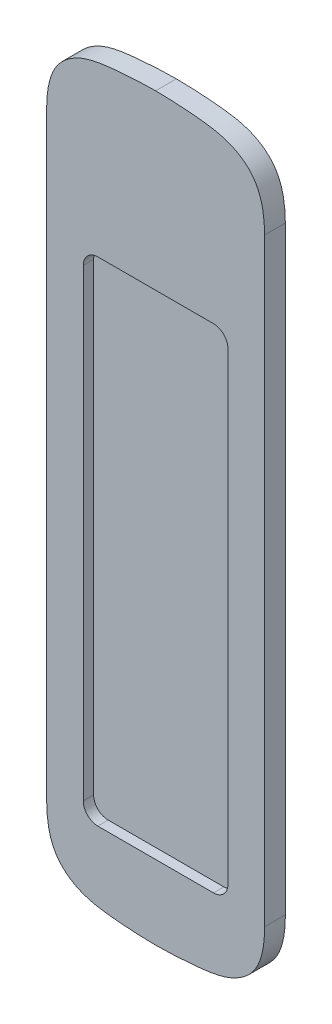
ISO-10303-21;
HEADER;
FILE_DESCRIPTION(('STEP AP214'),'2;1');
FILE_NAME('part.step','',(''),(''),'','','');
FILE_SCHEMA(('AUTOMOTIVE_DESIGN { 1 0 10303 214 1 1 1 1 }'));
ENDSEC;
DATA;
#1=APPLICATION_CONTEXT('core data for automotive mechanical design processes');
#2=APPLICATION_PROTOCOL_DEFINITION('international standard','automotive_design',2000,#1);
#3=PRODUCT_CONTEXT('',#1,'mechanical');
#4=PRODUCT('Part','Part','',(#3));
#5=PRODUCT_RELATED_PRODUCT_CATEGORY('part','',(#4));
#6=PRODUCT_DEFINITION_FORMATION('','',#4);
#7=PRODUCT_DEFINITION_CONTEXT('part definition',#1,'design');
#8=PRODUCT_DEFINITION('design','',#6,#7);
#9=PRODUCT_DEFINITION_SHAPE('','',#8);
#10=(LENGTH_UNIT() NAMED_UNIT(*) SI_UNIT(.MILLI.,.METRE.));
#11=(NAMED_UNIT(*) PLANE_ANGLE_UNIT() SI_UNIT($,.RADIAN.));
#12=(NAMED_UNIT(*) SI_UNIT($,.STERADIAN.) SOLID_ANGLE_UNIT());
#13=UNCERTAINTY_MEASURE_WITH_UNIT(LENGTH_MEASURE(1.E-05),#10,'distance_accuracy_value','');
#14=(GEOMETRIC_REPRESENTATION_CONTEXT(3) GLOBAL_UNCERTAINTY_ASSIGNED_CONTEXT((#13)) GLOBAL_UNIT_ASSIGNED_CONTEXT((#10,
#11,#12)) REPRESENTATION_CONTEXT('',''));
#15=CARTESIAN_POINT('',(0.,0.,0.));
#16=DIRECTION('',(0.,0.,1.));
#17=DIRECTION('',(1.,0.,0.));
#18=AXIS2_PLACEMENT_3D('',#15,#16,#17);
#19=CARTESIAN_POINT('',(-0.0122740685174845,-55.692882672514,1.));
#20=CARTESIAN_POINT('',(0.433053801516718,-55.6929315109198,1.));
#21=CARTESIAN_POINT('',(1.21932204899037,-55.6502766932318,1.));
#22=CARTESIAN_POINT('',(2.3591068483519,-55.5673054083304,1.));
#23=CARTESIAN_POINT('',(3.37474011353783,-55.3731999454156,1.));
#24=CARTESIAN_POINT('',(4.15776912429931,-55.003717167909,1.));
#25=CARTESIAN_POINT('',(5.11245324302639,-54.080149921374,1.));
#26=CARTESIAN_POINT('',(5.24423894281983,-52.9903180868331,1.));
#27=CARTESIAN_POINT('',(5.24423894306295,-52.2963469939325,1.));
#28=B_SPLINE_CURVE_WITH_KNOTS('',3,(#19,#20,#21,#22,#23,#24,#25,#26,#27),.UNSPECIFIED.,.F.,.F.,
(4,1,1,1,1,1,4),(0.,0.168658618872294,0.34779335919909,0.462795529222339,0.595545999496961,
0.698839991713686,1.),.UNSPECIFIED.);
#29=DIRECTION('',(0.,0.,-1.));
#30=VECTOR('',#29,1.);
#31=SURFACE_OF_LINEAR_EXTRUSION('',#28,#30);
#32=CARTESIAN_POINT('',(-0.0122740685174845,-55.692882672514,0.));
#33=CARTESIAN_POINT('',(0.433053801516718,-55.6929315109198,0.));
#34=CARTESIAN_POINT('',(1.21932204899037,-55.6502766932318,0.));
#35=CARTESIAN_POINT('',(2.3591068483519,-55.5673054083304,0.));
#36=CARTESIAN_POINT('',(3.37474011353783,-55.3731999454156,0.));
#37=CARTESIAN_POINT('',(4.15776912429931,-55.003717167909,0.));
#38=CARTESIAN_POINT('',(5.11245324302639,-54.080149921374,0.));
#39=CARTESIAN_POINT('',(5.24423894281983,-52.9903180868331,0.));
#40=CARTESIAN_POINT('',(5.24423894306295,-52.2963469939325,0.));
#41=B_SPLINE_CURVE_WITH_KNOTS('',3,(#32,#33,#34,#35,#36,#37,#38,#39,#40),.UNSPECIFIED.,.F.,.F.,
(4,1,1,1,1,1,4),(0.,0.168658618872294,0.34779335919909,0.462795529222339,0.595545999496961,
0.698839991713686,1.),.UNSPECIFIED.);
#42=CARTESIAN_POINT('',(-0.0122740685174938,-55.692882672514,0.));
#43=VERTEX_POINT('',#42);
#44=CARTESIAN_POINT('',(5.24423894306295,-52.2963469939325,0.));
#45=VERTEX_POINT('',#44);
#46=EDGE_CURVE('E155',#43,#45,#41,.T.);
#47=ORIENTED_EDGE('',*,*,#46,.T.);
#48=DIRECTION('',(0.,0.,-1.));
#49=VECTOR('',#48,1.);
#50=CARTESIAN_POINT('',(5.24423894306295,-52.2963469939325,1.));
#51=LINE('',#50,#49);
#52=CARTESIAN_POINT('',(5.24423894306295,-52.2963469939325,1.));
#53=VERTEX_POINT('',#52);
#54=EDGE_CURVE('E136',#53,#45,#51,.T.);
#55=ORIENTED_EDGE('',*,*,#54,.F.);
#56=CARTESIAN_POINT('',(-0.0122740685174938,-55.692882672514,1.));
#57=VERTEX_POINT('',#56);
#58=EDGE_CURVE('E143',#57,#53,#28,.T.);
#59=ORIENTED_EDGE('',*,*,#58,.F.);
#60=DIRECTION('',(0.,0.,-1.));
#61=VECTOR('',#60,1.);
#62=CARTESIAN_POINT('',(-0.0122740685174938,-55.692882672514,1.));
#63=LINE('',#62,#61);
#64=EDGE_CURVE('E297',#57,#43,#63,.T.);
#65=ORIENTED_EDGE('',*,*,#64,.T.);
#66=EDGE_LOOP('',(#47,#55,#59,#65));
#67=FACE_BOUND('',#66,.T.);
#68=ADVANCED_FACE('F32',(#67),#31,.F.);
#69=CARTESIAN_POINT('',(5.24423894306295,-52.2963469939325,1.));
#70=DIRECTION('',(-1.,3.50327697949891E-10,0.));
#71=DIRECTION('',(-3.50327697949891E-10,-1.,0.));
#72=AXIS2_PLACEMENT_3D('',#69,#70,#71);
#73=PLANE('',#72);
#74=DIRECTION('',(3.50327697949891E-10,1.,0.));
#75=VECTOR('',#74,1.);
#76=CARTESIAN_POINT('',(5.24423894306295,-52.2963469939325,0.));
#77=LINE('',#76,#75);
#78=CARTESIAN_POINT('',(5.24423895318766,-23.3956530813809,0.));
#79=VERTEX_POINT('',#78);
#80=EDGE_CURVE('E306',#45,#79,#77,.T.);
#81=ORIENTED_EDGE('',*,*,#80,.T.);
#82=DIRECTION('',(0.,0.,-1.));
#83=VECTOR('',#82,1.);
#84=CARTESIAN_POINT('',(5.24423895318766,-23.3956530813809,1.));
#85=LINE('',#84,#83);
#86=CARTESIAN_POINT('',(5.24423895318766,-23.3956530813809,1.));
#87=VERTEX_POINT('',#86);
#88=EDGE_CURVE('E139',#87,#79,#85,.T.);
#89=ORIENTED_EDGE('',*,*,#88,.F.);
#90=DIRECTION('',(3.50327697949891E-10,1.,0.));
#91=VECTOR('',#90,1.);
#92=CARTESIAN_POINT('',(5.24423894306295,-52.2963469939325,1.));
#93=LINE('',#92,#91);
#94=EDGE_CURVE('E132',#53,#87,#93,.T.);
#95=ORIENTED_EDGE('',*,*,#94,.F.);
#96=ORIENTED_EDGE('',*,*,#54,.T.);
#97=EDGE_LOOP('',(#81,#89,#95,#96));
#98=FACE_BOUND('',#97,.T.);
#99=ADVANCED_FACE('F134',(#98),#73,.F.);
#100=CARTESIAN_POINT('',(5.24423895318766,-23.3956530813809,1.));
#101=CARTESIAN_POINT('',(5.24423895343078,-22.7016819884803,1.));
#102=CARTESIAN_POINT('',(5.11245325440093,-21.6118501538471,1.));
#103=CARTESIAN_POINT('',(4.15776913632095,-20.6882829066432,1.));
#104=CARTESIAN_POINT('',(3.37474012581835,-20.3188001285879,1.));
#105=CARTESIAN_POINT('',(2.35910686076843,-20.1246946649615,1.));
#106=CARTESIAN_POINT('',(1.21932206146504,-20.0417233792615,1.));
#107=CARTESIAN_POINT('',(0.433053814021267,-19.9990685610227,1.));
#108=CARTESIAN_POINT('',(-0.0122740560129697,-19.9991173991164,1.));
#109=B_SPLINE_CURVE_WITH_KNOTS('',3,(#100,#101,#102,#103,#104,#105,#106,#107,#108),
.UNSPECIFIED.,.F.,.F.,(4,1,1,1,1,1,4),(0.,0.301160008286314,0.404454000503039,0.537204470777661,
0.65220664080091,0.831341381127706,1.),.UNSPECIFIED.);
#110=DIRECTION('',(0.,0.,-1.));
#111=VECTOR('',#110,1.);
#112=SURFACE_OF_LINEAR_EXTRUSION('',#109,#111);
#113=CARTESIAN_POINT('',(5.24423895318766,-23.3956530813809,0.));
#114=CARTESIAN_POINT('',(5.24423895343078,-22.7016819884803,0.));
#115=CARTESIAN_POINT('',(5.11245325440093,-21.6118501538471,0.));
#116=CARTESIAN_POINT('',(4.15776913632095,-20.6882829066432,0.));
#117=CARTESIAN_POINT('',(3.37474012581835,-20.3188001285879,0.));
#118=CARTESIAN_POINT('',(2.35910686076843,-20.1246946649615,0.));
#119=CARTESIAN_POINT('',(1.21932206146504,-20.0417233792615,0.));
#120=CARTESIAN_POINT('',(0.433053814021267,-19.9990685610227,0.));
#121=CARTESIAN_POINT('',(-0.0122740560129697,-19.9991173991164,0.));
#122=B_SPLINE_CURVE_WITH_KNOTS('',3,(#113,#114,#115,#116,#117,#118,#119,#120,#121),
.UNSPECIFIED.,.F.,.F.,(4,1,1,1,1,1,4),(0.,0.301160008286314,0.404454000503039,0.537204470777661,
0.65220664080091,0.831341381127706,1.),.UNSPECIFIED.);
#123=CARTESIAN_POINT('',(-0.0122740560129697,-19.9991173991164,0.));
#124=VERTEX_POINT('',#123);
#125=EDGE_CURVE('E311',#79,#124,#122,.T.);
#126=ORIENTED_EDGE('',*,*,#125,.T.);
#127=DIRECTION('',(0.,0.,-1.));
#128=VECTOR('',#127,1.);
#129=CARTESIAN_POINT('',(-0.0122740560129697,-19.9991173991164,1.));
#130=LINE('',#129,#128);
#131=CARTESIAN_POINT('',(-0.0122740560129697,-19.9991173991164,1.));
#132=VERTEX_POINT('',#131);
#133=EDGE_CURVE('E160',#132,#124,#130,.T.);
#134=ORIENTED_EDGE('',*,*,#133,.F.);
#135=EDGE_CURVE('E142',#87,#132,#109,.T.);
#136=ORIENTED_EDGE('',*,*,#135,.F.);
#137=ORIENTED_EDGE('',*,*,#88,.T.);
#138=EDGE_LOOP('',(#126,#134,#136,#137));
#139=FACE_BOUND('',#138,.T.);
#140=ADVANCED_FACE('F354',(#139),#112,.F.);
#141=CARTESIAN_POINT('',(-0.0122740560129834,-19.9991173991164,1.));
#142=CARTESIAN_POINT('',(-0.457601926047186,-19.9990685607107,1.));
#143=CARTESIAN_POINT('',(-1.24387017352084,-20.0417233783986,1.));
#144=CARTESIAN_POINT('',(-2.38365497288237,-20.1246946633,1.));
#145=CARTESIAN_POINT('',(-3.39928823806829,-20.3188001262148,1.));
#146=CARTESIAN_POINT('',(-4.18231724882977,-20.6882829037214,1.));
#147=CARTESIAN_POINT('',(-5.13700136755686,-21.6118501502564,1.));
#148=CARTESIAN_POINT('',(-5.2687870673503,-22.7016819847973,1.));
#149=CARTESIAN_POINT('',(-5.26878706759342,-23.3956530776979,1.));
#150=B_SPLINE_CURVE_WITH_KNOTS('',3,(#141,#142,#143,#144,#145,#146,#147,#148,#149),
.UNSPECIFIED.,.F.,.F.,(4,1,1,1,1,1,4),(0.,0.168658618872294,0.34779335919909,0.462795529222339,
0.595545999496961,0.698839991713686,1.),.UNSPECIFIED.);
#151=DIRECTION('',(0.,0.,-1.));
#152=VECTOR('',#151,1.);
#153=SURFACE_OF_LINEAR_EXTRUSION('',#150,#152);
#154=CARTESIAN_POINT('',(-0.0122740560129834,-19.9991173991164,0.));
#155=CARTESIAN_POINT('',(-0.457601926047186,-19.9990685607107,0.));
#156=CARTESIAN_POINT('',(-1.24387017352084,-20.0417233783986,0.));
#157=CARTESIAN_POINT('',(-2.38365497288237,-20.1246946633,0.));
#158=CARTESIAN_POINT('',(-3.39928823806829,-20.3188001262148,0.));
#159=CARTESIAN_POINT('',(-4.18231724882977,-20.6882829037214,0.));
#160=CARTESIAN_POINT('',(-5.13700136755686,-21.6118501502564,0.));
#161=CARTESIAN_POINT('',(-5.2687870673503,-22.7016819847973,0.));
#162=CARTESIAN_POINT('',(-5.26878706759342,-23.3956530776979,0.));
#163=B_SPLINE_CURVE_WITH_KNOTS('',3,(#154,#155,#156,#157,#158,#159,#160,#161,#162),
.UNSPECIFIED.,.F.,.F.,(4,1,1,1,1,1,4),(0.,0.168658618872294,0.34779335919909,0.462795529222339,
0.595545999496961,0.698839991713686,1.),.UNSPECIFIED.);
#164=CARTESIAN_POINT('',(-5.26878706759342,-23.3956530776979,0.));
#165=VERTEX_POINT('',#164);
#166=EDGE_CURVE('E315',#124,#165,#163,.T.);
#167=ORIENTED_EDGE('',*,*,#166,.T.);
#168=DIRECTION('',(0.,0.,-1.));
#169=VECTOR('',#168,1.);
#170=CARTESIAN_POINT('',(-5.26878706759342,-23.3956530776979,1.));
#171=LINE('',#170,#169);
#172=CARTESIAN_POINT('',(-5.26878706759342,-23.3956530776979,1.));
#173=VERTEX_POINT('',#172);
#174=EDGE_CURVE('E337',#173,#165,#171,.T.);
#175=ORIENTED_EDGE('',*,*,#174,.F.);
#176=EDGE_CURVE('E346',#132,#173,#150,.T.);
#177=ORIENTED_EDGE('',*,*,#176,.F.);
#178=ORIENTED_EDGE('',*,*,#133,.T.);
#179=EDGE_LOOP('',(#167,#175,#177,#178));
#180=FACE_BOUND('',#179,.T.);
#181=ADVANCED_FACE('F344',(#180),#153,.F.);
#182=CARTESIAN_POINT('',(-5.26878706759342,-23.3956530776979,1.));
#183=DIRECTION('',(1.,-3.50327577902706E-10,0.));
#184=DIRECTION('',(3.50327577902706E-10,1.,0.));
#185=AXIS2_PLACEMENT_3D('',#182,#183,#184);
#186=PLANE('',#185);
#187=DIRECTION('',(-3.50327577902706E-10,-1.,0.));
#188=VECTOR('',#187,1.);
#189=CARTESIAN_POINT('',(-5.26878706759342,-23.3956530776979,0.));
#190=LINE('',#189,#188);
#191=CARTESIAN_POINT('',(-5.26878707771813,-52.2963469902495,0.));
#192=VERTEX_POINT('',#191);
#193=EDGE_CURVE('E322',#165,#192,#190,.T.);
#194=ORIENTED_EDGE('',*,*,#193,.T.);
#195=DIRECTION('',(0.,0.,-1.));
#196=VECTOR('',#195,1.);
#197=CARTESIAN_POINT('',(-5.26878707771813,-52.2963469902495,1.));
#198=LINE('',#197,#196);
#199=CARTESIAN_POINT('',(-5.26878707771813,-52.2963469902495,1.));
#200=VERTEX_POINT('',#199);
#201=EDGE_CURVE('E334',#200,#192,#198,.T.);
#202=ORIENTED_EDGE('',*,*,#201,.F.);
#203=DIRECTION('',(-3.50327577902706E-10,-1.,0.));
#204=VECTOR('',#203,1.);
#205=CARTESIAN_POINT('',(-5.26878706759342,-23.3956530776979,1.));
#206=LINE('',#205,#204);
#207=EDGE_CURVE('E298',#173,#200,#206,.T.);
#208=ORIENTED_EDGE('',*,*,#207,.F.);
#209=ORIENTED_EDGE('',*,*,#174,.T.);
#210=EDGE_LOOP('',(#194,#202,#208,#209));
#211=FACE_BOUND('',#210,.T.);
#212=ADVANCED_FACE('F289',(#211),#186,.F.);
#213=CARTESIAN_POINT('',(-5.26878707771813,-52.2963469902495,1.));
#214=CARTESIAN_POINT('',(-5.26878707796125,-52.9903180831501,1.));
#215=CARTESIAN_POINT('',(-5.1370013789314,-54.0801499177833,1.));
#216=CARTESIAN_POINT('',(-4.18231726085142,-55.0037171649872,1.));
#217=CARTESIAN_POINT('',(-3.39928825034882,-55.3731999430425,1.));
#218=CARTESIAN_POINT('',(-2.3836549852989,-55.5673054066689,1.));
#219=CARTESIAN_POINT('',(-1.2438701859955,-55.6502766923689,1.));
#220=CARTESIAN_POINT('',(-0.45760193855173,-55.6929315106077,1.));
#221=CARTESIAN_POINT('',(-0.0122740685174938,-55.692882672514,1.));
#222=B_SPLINE_CURVE_WITH_KNOTS('',3,(#213,#214,#215,#216,#217,#218,#219,#220,#221),
.UNSPECIFIED.,.F.,.F.,(4,1,1,1,1,1,4),(0.,0.301160008286314,0.404454000503039,0.537204470777661,
0.65220664080091,0.831341381127706,1.),.UNSPECIFIED.);
#223=DIRECTION('',(0.,0.,-1.));
#224=VECTOR('',#223,1.);
#225=SURFACE_OF_LINEAR_EXTRUSION('',#222,#224);
#226=CARTESIAN_POINT('',(-5.26878707771813,-52.2963469902495,0.));
#227=CARTESIAN_POINT('',(-5.26878707796125,-52.9903180831501,0.));
#228=CARTESIAN_POINT('',(-5.1370013789314,-54.0801499177833,0.));
#229=CARTESIAN_POINT('',(-4.18231726085142,-55.0037171649872,0.));
#230=CARTESIAN_POINT('',(-3.39928825034882,-55.3731999430425,0.));
#231=CARTESIAN_POINT('',(-2.3836549852989,-55.5673054066689,0.));
#232=CARTESIAN_POINT('',(-1.2438701859955,-55.6502766923689,0.));
#233=CARTESIAN_POINT('',(-0.45760193855173,-55.6929315106077,0.));
#234=CARTESIAN_POINT('',(-0.0122740685174938,-55.692882672514,0.));
#235=B_SPLINE_CURVE_WITH_KNOTS('',3,(#226,#227,#228,#229,#230,#231,#232,#233,#234),
.UNSPECIFIED.,.F.,.F.,(4,1,1,1,1,1,4),(0.,0.301160008286314,0.404454000503039,0.537204470777661,
0.65220664080091,0.831341381127706,1.),.UNSPECIFIED.);
#236=EDGE_CURVE('E152',#192,#43,#235,.T.);
#237=ORIENTED_EDGE('',*,*,#236,.T.);
#238=ORIENTED_EDGE('',*,*,#64,.F.);
#239=EDGE_CURVE('E148',#200,#57,#222,.T.);
#240=ORIENTED_EDGE('',*,*,#239,.F.);
#241=ORIENTED_EDGE('',*,*,#201,.T.);
#242=EDGE_LOOP('',(#237,#238,#240,#241));
#243=FACE_BOUND('',#242,.T.);
#244=ADVANCED_FACE('F282',(#243),#225,.F.);
#245=CARTESIAN_POINT('',(3.57942521402291,-55.2574550946814,1.));
#246=DIRECTION('',(0.,0.,-1.));
#247=DIRECTION('',(-1.,0.,0.));
#248=AXIS2_PLACEMENT_3D('',#245,#246,#247);
#249=PLANE('',#248);
#250=DIRECTION('',(1.,0.,0.));
#251=VECTOR('',#250,1.);
#252=CARTESIAN_POINT('',(-3.5022740446155,-28.332000037375,1.));
#253=LINE('',#252,#251);
#254=CARTESIAN_POINT('',(-2.8022740446155,-28.332000037375,1.));
#255=VERTEX_POINT('',#254);
#256=CARTESIAN_POINT('',(2.77772593178569,-28.332000037375,1.));
#257=VERTEX_POINT('',#256);
#258=EDGE_CURVE('E225',#255,#257,#253,.T.);
#259=ORIENTED_EDGE('',*,*,#258,.T.);
#260=CARTESIAN_POINT('',(2.77772593178569,-29.032000037375,1.));
#261=DIRECTION('',(0.,0.,-1.));
#262=DIRECTION('',(-1.,0.,0.));
#263=AXIS2_PLACEMENT_3D('',#260,#261,#262);
#264=CIRCLE('',#263,0.7);
#265=CARTESIAN_POINT('',(3.47772593178569,-29.032000037375,1.));
#266=VERTEX_POINT('',#265);
#267=EDGE_CURVE('E11',#257,#266,#264,.T.);
#268=ORIENTED_EDGE('',*,*,#267,.T.);
#269=DIRECTION('',(0.,-1.,0.));
#270=VECTOR('',#269,1.);
#271=CARTESIAN_POINT('',(3.47772593178569,-28.332000037375,1.));
#272=LINE('',#271,#270);
#273=CARTESIAN_POINT('',(3.4777259317857,-51.412000037375,1.));
#274=VERTEX_POINT('',#273);
#275=EDGE_CURVE('E194',#266,#274,#272,.T.);
#276=ORIENTED_EDGE('',*,*,#275,.T.);
#277=CARTESIAN_POINT('',(2.7777259317857,-51.412000037375,1.));
#278=DIRECTION('',(0.,0.,-1.));
#279=DIRECTION('',(-1.,0.,0.));
#280=AXIS2_PLACEMENT_3D('',#277,#278,#279);
#281=CIRCLE('',#280,0.7);
#282=CARTESIAN_POINT('',(2.7777259317857,-52.112000037375,1.));
#283=VERTEX_POINT('',#282);
#284=EDGE_CURVE('E40',#274,#283,#281,.T.);
#285=ORIENTED_EDGE('',*,*,#284,.T.);
#286=DIRECTION('',(1.,0.,0.));
#287=VECTOR('',#286,1.);
#288=CARTESIAN_POINT('',(-3.5022740446155,-52.112000037375,1.));
#289=LINE('',#288,#287);
#290=CARTESIAN_POINT('',(-2.8022740446155,-52.112000037375,1.));
#291=VERTEX_POINT('',#290);
#292=EDGE_CURVE('E193',#291,#283,#289,.T.);
#293=ORIENTED_EDGE('',*,*,#292,.F.);
#294=CARTESIAN_POINT('',(-2.8022740446155,-51.412000037375,1.));
#295=DIRECTION('',(0.,0.,-1.));
#296=DIRECTION('',(-1.,0.,0.));
#297=AXIS2_PLACEMENT_3D('',#294,#295,#296);
#298=CIRCLE('',#297,0.7);
#299=CARTESIAN_POINT('',(-3.5022740446155,-51.412000037375,1.));
#300=VERTEX_POINT('',#299);
#301=EDGE_CURVE('E190',#291,#300,#298,.T.);
#302=ORIENTED_EDGE('',*,*,#301,.T.);
#303=DIRECTION('',(0.,-1.,0.));
#304=VECTOR('',#303,1.);
#305=CARTESIAN_POINT('',(-3.5022740446155,-28.332000037375,1.));
#306=LINE('',#305,#304);
#307=CARTESIAN_POINT('',(-3.5022740446155,-29.032000037375,1.));
#308=VERTEX_POINT('',#307);
#309=EDGE_CURVE('E219',#308,#300,#306,.T.);
#310=ORIENTED_EDGE('',*,*,#309,.F.);
#311=CARTESIAN_POINT('',(-2.8022740446155,-29.032000037375,1.));
#312=DIRECTION('',(0.,0.,-1.));
#313=DIRECTION('',(-1.,0.,0.));
#314=AXIS2_PLACEMENT_3D('',#311,#312,#313);
#315=CIRCLE('',#314,0.7);
#316=EDGE_CURVE('E188',#308,#255,#315,.T.);
#317=ORIENTED_EDGE('',*,*,#316,.T.);
#318=EDGE_LOOP('',(#259,#268,#276,#285,#293,#302,#310,#317));
#319=FACE_BOUND('',#318,.T.);
#320=ORIENTED_EDGE('',*,*,#58,.T.);
#321=ORIENTED_EDGE('',*,*,#94,.T.);
#322=ORIENTED_EDGE('',*,*,#135,.T.);
#323=ORIENTED_EDGE('',*,*,#176,.T.);
#324=ORIENTED_EDGE('',*,*,#207,.T.);
#325=ORIENTED_EDGE('',*,*,#239,.T.);
#326=EDGE_LOOP('',(#320,#321,#322,#323,#324,#325));
#327=FACE_BOUND('',#326,.T.);
#328=ADVANCED_FACE('F146',(#319,#327),#249,.F.);
#329=CARTESIAN_POINT('',(3.57942521402291,-55.2574550946814,0.));
#330=DIRECTION('',(0.,0.,-1.));
#331=DIRECTION('',(-1.,0.,0.));
#332=AXIS2_PLACEMENT_3D('',#329,#330,#331);
#333=PLANE('',#332);
#334=ORIENTED_EDGE('',*,*,#46,.F.);
#335=ORIENTED_EDGE('',*,*,#236,.F.);
#336=ORIENTED_EDGE('',*,*,#193,.F.);
#337=ORIENTED_EDGE('',*,*,#166,.F.);
#338=ORIENTED_EDGE('',*,*,#125,.F.);
#339=ORIENTED_EDGE('',*,*,#80,.F.);
#340=EDGE_LOOP('',(#334,#335,#336,#337,#338,#339));
#341=FACE_BOUND('',#340,.T.);
#342=ADVANCED_FACE('F274',(#341),#333,.T.);
#343=CARTESIAN_POINT('',(-3.5022740446155,-52.112000037375,0.5));
#344=DIRECTION('',(0.,-1.,0.));
#345=DIRECTION('',(0.,0.,-1.));
#346=AXIS2_PLACEMENT_3D('',#343,#344,#345);
#347=PLANE('',#346);
#348=DIRECTION('',(1.,0.,0.));
#349=VECTOR('',#348,1.);
#350=CARTESIAN_POINT('',(-3.5022740446155,-52.112000037375,0.5));
#351=LINE('',#350,#349);
#352=CARTESIAN_POINT('',(-2.8022740446155,-52.112000037375,0.5));
#353=VERTEX_POINT('',#352);
#354=CARTESIAN_POINT('',(2.7777259317857,-52.112000037375,0.5));
#355=VERTEX_POINT('',#354);
#356=EDGE_CURVE('E210',#353,#355,#351,.T.);
#357=ORIENTED_EDGE('',*,*,#356,.F.);
#358=DIRECTION('',(0.,0.,1.));
#359=VECTOR('',#358,1.);
#360=CARTESIAN_POINT('',(-2.8022740446155,-52.112000037375,1.));
#361=LINE('',#360,#359);
#362=EDGE_CURVE('E181',#353,#291,#361,.T.);
#363=ORIENTED_EDGE('',*,*,#362,.T.);
#364=ORIENTED_EDGE('',*,*,#292,.T.);
#365=DIRECTION('',(0.,0.,1.));
#366=VECTOR('',#365,1.);
#367=CARTESIAN_POINT('',(2.7777259317857,-52.112000037375,0.5));
#368=LINE('',#367,#366);
#369=EDGE_CURVE('E179',#283,#355,#368,.F.);
#370=ORIENTED_EDGE('',*,*,#369,.T.);
#371=EDGE_LOOP('',(#357,#363,#364,#370));
#372=FACE_BOUND('',#371,.T.);
#373=ADVANCED_FACE('F197',(#372),#347,.F.);
#374=CARTESIAN_POINT('',(-3.5022740446155,-28.332000037375,0.5));
#375=DIRECTION('',(-1.,0.,0.));
#376=DIRECTION('',(0.,-1.,0.));
#377=AXIS2_PLACEMENT_3D('',#374,#375,#376);
#378=PLANE('',#377);
#379=DIRECTION('',(0.,-1.,0.));
#380=VECTOR('',#379,1.);
#381=CARTESIAN_POINT('',(-3.5022740446155,-28.332000037375,0.5));
#382=LINE('',#381,#380);
#383=CARTESIAN_POINT('',(-3.5022740446155,-29.032000037375,0.5));
#384=VERTEX_POINT('',#383);
#385=CARTESIAN_POINT('',(-3.5022740446155,-51.412000037375,0.5));
#386=VERTEX_POINT('',#385);
#387=EDGE_CURVE('E217',#384,#386,#382,.T.);
#388=ORIENTED_EDGE('',*,*,#387,.F.);
#389=DIRECTION('',(0.,0.,1.));
#390=VECTOR('',#389,1.);
#391=CARTESIAN_POINT('',(-3.5022740446155,-29.032000037375,0.5));
#392=LINE('',#391,#390);
#393=EDGE_CURVE('E158',#384,#308,#392,.T.);
#394=ORIENTED_EDGE('',*,*,#393,.T.);
#395=ORIENTED_EDGE('',*,*,#309,.T.);
#396=DIRECTION('',(0.,0.,1.));
#397=VECTOR('',#396,1.);
#398=CARTESIAN_POINT('',(-3.5022740446155,-51.412000037375,0.5));
#399=LINE('',#398,#397);
#400=EDGE_CURVE('E156',#300,#386,#399,.F.);
#401=ORIENTED_EDGE('',*,*,#400,.T.);
#402=EDGE_LOOP('',(#388,#394,#395,#401));
#403=FACE_BOUND('',#402,.T.);
#404=ADVANCED_FACE('F264',(#403),#378,.F.);
#405=CARTESIAN_POINT('',(-3.5022740446155,-28.332000037375,0.5));
#406=DIRECTION('',(0.,-1.,0.));
#407=DIRECTION('',(0.,0.,-1.));
#408=AXIS2_PLACEMENT_3D('',#405,#406,#407);
#409=PLANE('',#408);
#410=ORIENTED_EDGE('',*,*,#258,.F.);
#411=DIRECTION('',(0.,0.,1.));
#412=VECTOR('',#411,1.);
#413=CARTESIAN_POINT('',(-2.8022740446155,-28.332000037375,0.5));
#414=LINE('',#413,#412);
#415=CARTESIAN_POINT('',(-2.8022740446155,-28.332000037375,0.5));
#416=VERTEX_POINT('',#415);
#417=EDGE_CURVE('E169',#255,#416,#414,.F.);
#418=ORIENTED_EDGE('',*,*,#417,.T.);
#419=DIRECTION('',(1.,0.,0.));
#420=VECTOR('',#419,1.);
#421=CARTESIAN_POINT('',(-3.5022740446155,-28.332000037375,0.5));
#422=LINE('',#421,#420);
#423=CARTESIAN_POINT('',(2.77772593178569,-28.332000037375,0.5));
#424=VERTEX_POINT('',#423);
#425=EDGE_CURVE('E214',#416,#424,#422,.T.);
#426=ORIENTED_EDGE('',*,*,#425,.T.);
#427=DIRECTION('',(0.,0.,1.));
#428=VECTOR('',#427,1.);
#429=CARTESIAN_POINT('',(2.77772593178569,-28.332000037375,1.));
#430=LINE('',#429,#428);
#431=EDGE_CURVE('E166',#424,#257,#430,.T.);
#432=ORIENTED_EDGE('',*,*,#431,.T.);
#433=EDGE_LOOP('',(#410,#418,#426,#432));
#434=FACE_BOUND('',#433,.T.);
#435=ADVANCED_FACE('F258',(#434),#409,.T.);
#436=CARTESIAN_POINT('',(3.47772593178569,-28.332000037375,0.5));
#437=DIRECTION('',(-1.,0.,0.));
#438=DIRECTION('',(0.,-1.,0.));
#439=AXIS2_PLACEMENT_3D('',#436,#437,#438);
#440=PLANE('',#439);
#441=DIRECTION('',(0.,-1.,0.));
#442=VECTOR('',#441,1.);
#443=CARTESIAN_POINT('',(3.47772593178569,-28.332000037375,0.5));
#444=LINE('',#443,#442);
#445=CARTESIAN_POINT('',(3.47772593178569,-29.032000037375,0.5));
#446=VERTEX_POINT('',#445);
#447=CARTESIAN_POINT('',(3.4777259317857,-51.412000037375,0.5));
#448=VERTEX_POINT('',#447);
#449=EDGE_CURVE('E208',#446,#448,#444,.T.);
#450=ORIENTED_EDGE('',*,*,#449,.T.);
#451=DIRECTION('',(0.,0.,1.));
#452=VECTOR('',#451,1.);
#453=CARTESIAN_POINT('',(3.4777259317857,-51.412000037375,0.5));
#454=LINE('',#453,#452);
#455=EDGE_CURVE('E186',#448,#274,#454,.T.);
#456=ORIENTED_EDGE('',*,*,#455,.T.);
#457=ORIENTED_EDGE('',*,*,#275,.F.);
#458=DIRECTION('',(0.,0.,1.));
#459=VECTOR('',#458,1.);
#460=CARTESIAN_POINT('',(3.47772593178569,-29.032000037375,0.5));
#461=LINE('',#460,#459);
#462=EDGE_CURVE('E184',#266,#446,#461,.F.);
#463=ORIENTED_EDGE('',*,*,#462,.T.);
#464=EDGE_LOOP('',(#450,#456,#457,#463));
#465=FACE_BOUND('',#464,.T.);
#466=ADVANCED_FACE('F212',(#465),#440,.T.);
#467=CARTESIAN_POINT('',(0.,0.,0.5));
#468=DIRECTION('',(0.,0.,-1.));
#469=DIRECTION('',(-1.,0.,0.));
#470=AXIS2_PLACEMENT_3D('',#467,#468,#469);
#471=PLANE('',#470);
#472=ORIENTED_EDGE('',*,*,#425,.F.);
#473=CARTESIAN_POINT('',(-2.8022740446155,-29.032000037375,0.5));
#474=DIRECTION('',(0.,0.,-1.));
#475=DIRECTION('',(-1.,0.,0.));
#476=AXIS2_PLACEMENT_3D('',#473,#474,#475);
#477=CIRCLE('',#476,0.7);
#478=EDGE_CURVE('E177',#416,#384,#477,.F.);
#479=ORIENTED_EDGE('',*,*,#478,.T.);
#480=ORIENTED_EDGE('',*,*,#387,.T.);
#481=CARTESIAN_POINT('',(-2.8022740446155,-51.412000037375,0.5));
#482=DIRECTION('',(0.,0.,-1.));
#483=DIRECTION('',(-1.,0.,0.));
#484=AXIS2_PLACEMENT_3D('',#481,#482,#483);
#485=CIRCLE('',#484,0.7);
#486=EDGE_CURVE('E175',#386,#353,#485,.F.);
#487=ORIENTED_EDGE('',*,*,#486,.T.);
#488=ORIENTED_EDGE('',*,*,#356,.T.);
#489=CARTESIAN_POINT('',(2.7777259317857,-51.412000037375,0.5));
#490=DIRECTION('',(0.,0.,-1.));
#491=DIRECTION('',(-1.,0.,0.));
#492=AXIS2_PLACEMENT_3D('',#489,#490,#491);
#493=CIRCLE('',#492,0.7);
#494=EDGE_CURVE('E173',#355,#448,#493,.F.);
#495=ORIENTED_EDGE('',*,*,#494,.T.);
#496=ORIENTED_EDGE('',*,*,#449,.F.);
#497=CARTESIAN_POINT('',(2.77772593178569,-29.032000037375,0.5));
#498=DIRECTION('',(0.,0.,-1.));
#499=DIRECTION('',(-1.,0.,0.));
#500=AXIS2_PLACEMENT_3D('',#497,#498,#499);
#501=CIRCLE('',#500,0.7);
#502=EDGE_CURVE('E171',#446,#424,#501,.F.);
#503=ORIENTED_EDGE('',*,*,#502,.T.);
#504=EDGE_LOOP('',(#472,#479,#480,#487,#488,#495,#496,#503));
#505=FACE_BOUND('',#504,.T.);
#506=ADVANCED_FACE('F207',(#505),#471,.F.);
#507=CARTESIAN_POINT('',(-2.8022740446155,-29.032000037375,0.5));
#508=DIRECTION('',(0.,0.,1.));
#509=DIRECTION('',(1.,0.,0.));
#510=AXIS2_PLACEMENT_3D('',#507,#508,#509);
#511=CYLINDRICAL_SURFACE('',#510,0.7);
#512=ORIENTED_EDGE('',*,*,#478,.F.);
#513=ORIENTED_EDGE('',*,*,#417,.F.);
#514=ORIENTED_EDGE('',*,*,#316,.F.);
#515=ORIENTED_EDGE('',*,*,#393,.F.);
#516=EDGE_LOOP('',(#512,#513,#514,#515));
#517=FACE_BOUND('',#516,.T.);
#518=ADVANCED_FACE('F240',(#517),#511,.F.);
#519=CARTESIAN_POINT('',(-2.8022740446155,-51.412000037375,0.5));
#520=DIRECTION('',(0.,0.,-1.));
#521=DIRECTION('',(-1.,0.,0.));
#522=AXIS2_PLACEMENT_3D('',#519,#520,#521);
#523=CYLINDRICAL_SURFACE('',#522,0.7);
#524=ORIENTED_EDGE('',*,*,#486,.F.);
#525=ORIENTED_EDGE('',*,*,#400,.F.);
#526=ORIENTED_EDGE('',*,*,#301,.F.);
#527=ORIENTED_EDGE('',*,*,#362,.F.);
#528=EDGE_LOOP('',(#524,#525,#526,#527));
#529=FACE_BOUND('',#528,.T.);
#530=ADVANCED_FACE('F243',(#529),#523,.F.);
#531=CARTESIAN_POINT('',(2.7777259317857,-51.412000037375,0.5));
#532=DIRECTION('',(0.,0.,1.));
#533=DIRECTION('',(1.,0.,0.));
#534=AXIS2_PLACEMENT_3D('',#531,#532,#533);
#535=CYLINDRICAL_SURFACE('',#534,0.7);
#536=ORIENTED_EDGE('',*,*,#494,.F.);
#537=ORIENTED_EDGE('',*,*,#369,.F.);
#538=ORIENTED_EDGE('',*,*,#284,.F.);
#539=ORIENTED_EDGE('',*,*,#455,.F.);
#540=EDGE_LOOP('',(#536,#537,#538,#539));
#541=FACE_BOUND('',#540,.T.);
#542=ADVANCED_FACE('F202',(#541),#535,.F.);
#543=CARTESIAN_POINT('',(2.77772593178569,-29.032000037375,0.5));
#544=DIRECTION('',(0.,0.,-1.));
#545=DIRECTION('',(-1.,0.,0.));
#546=AXIS2_PLACEMENT_3D('',#543,#544,#545);
#547=CYLINDRICAL_SURFACE('',#546,0.7);
#548=ORIENTED_EDGE('',*,*,#502,.F.);
#549=ORIENTED_EDGE('',*,*,#462,.F.);
#550=ORIENTED_EDGE('',*,*,#267,.F.);
#551=ORIENTED_EDGE('',*,*,#431,.F.);
#552=EDGE_LOOP('',(#548,#549,#550,#551));
#553=FACE_BOUND('',#552,.T.);
#554=ADVANCED_FACE('F34',(#553),#547,.F.);
#555=CLOSED_SHELL('',(#68,#99,#140,#181,#212,#244,#328,#342,#373,#404,#435,#466,#506,#518,#530,
#542,#554));
#556=MANIFOLD_SOLID_BREP('B2',#555);
#557=ADVANCED_BREP_SHAPE_REPRESENTATION('',(#18,#556),#14);
#558=SHAPE_DEFINITION_REPRESENTATION(#9,#557);
ENDSEC;
END-ISO-10303-21;
